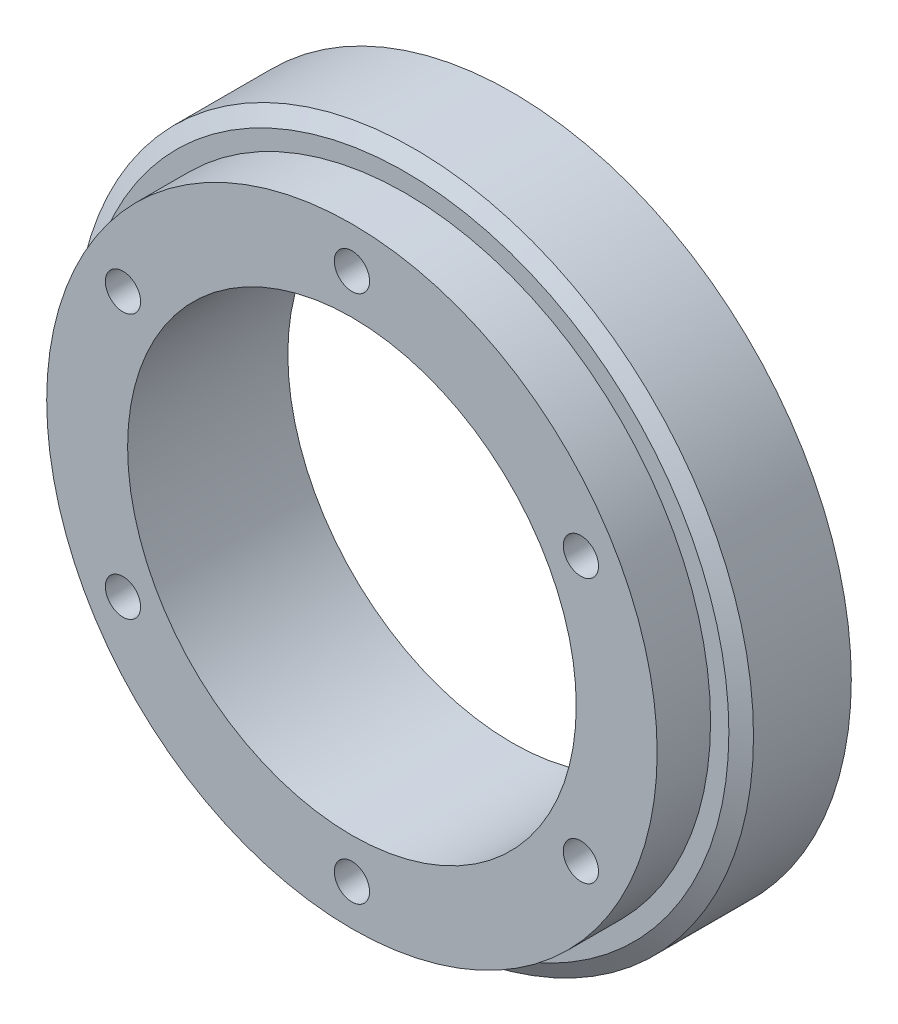
ISO-10303-21;
HEADER;
FILE_DESCRIPTION(('STEP AP214'),'2;1');
FILE_NAME('part.step','',(''),(''),'','','');
FILE_SCHEMA(('AUTOMOTIVE_DESIGN { 1 0 10303 214 1 1 1 1 }'));
ENDSEC;
DATA;
#1=APPLICATION_CONTEXT('core data for automotive mechanical design processes');
#2=APPLICATION_PROTOCOL_DEFINITION('international standard','automotive_design',2000,#1);
#3=PRODUCT_CONTEXT('',#1,'mechanical');
#4=PRODUCT('Part','Part','',(#3));
#5=PRODUCT_RELATED_PRODUCT_CATEGORY('part','',(#4));
#6=PRODUCT_DEFINITION_FORMATION('','',#4);
#7=PRODUCT_DEFINITION_CONTEXT('part definition',#1,'design');
#8=PRODUCT_DEFINITION('design','',#6,#7);
#9=PRODUCT_DEFINITION_SHAPE('','',#8);
#10=(LENGTH_UNIT() NAMED_UNIT(*) SI_UNIT(.MILLI.,.METRE.));
#11=(NAMED_UNIT(*) PLANE_ANGLE_UNIT() SI_UNIT($,.RADIAN.));
#12=(NAMED_UNIT(*) SI_UNIT($,.STERADIAN.) SOLID_ANGLE_UNIT());
#13=UNCERTAINTY_MEASURE_WITH_UNIT(LENGTH_MEASURE(1.E-05),#10,'distance_accuracy_value','');
#14=(GEOMETRIC_REPRESENTATION_CONTEXT(3) GLOBAL_UNCERTAINTY_ASSIGNED_CONTEXT((#13)) GLOBAL_UNIT_ASSIGNED_CONTEXT((#10,
#11,#12)) REPRESENTATION_CONTEXT('',''));
#15=CARTESIAN_POINT('',(0.,0.,0.));
#16=DIRECTION('',(0.,0.,1.));
#17=DIRECTION('',(1.,0.,0.));
#18=AXIS2_PLACEMENT_3D('',#15,#16,#17);
#19=CARTESIAN_POINT('',(0.,21.,0.));
#20=DIRECTION('',(0.,0.,1.));
#21=DIRECTION('',(1.,0.,0.));
#22=AXIS2_PLACEMENT_3D('',#19,#20,#21);
#23=PLANE('',#22);
#24=CARTESIAN_POINT('',(21.4341287436647,12.3750000000003,0.));
#25=DIRECTION('',(0.,0.,-1.));
#26=DIRECTION('',(-1.,0.,0.));
#27=AXIS2_PLACEMENT_3D('',#24,#25,#26);
#28=CIRCLE('',#27,1.64999999999999);
#29=CARTESIAN_POINT('',(19.7841287436647,12.3750000000003,0.));
#30=VERTEX_POINT('',#29);
#31=EDGE_CURVE('E102',#30,#30,#28,.T.);
#32=ORIENTED_EDGE('',*,*,#31,.F.);
#33=EDGE_LOOP('',(#32));
#34=FACE_BOUND('',#33,.T.);
#35=CARTESIAN_POINT('',(21.434128743665,-12.3749999999998,0.));
#36=DIRECTION('',(0.,0.,-1.));
#37=DIRECTION('',(-1.,0.,0.));
#38=AXIS2_PLACEMENT_3D('',#35,#36,#37);
#39=CIRCLE('',#38,1.64999999999999);
#40=CARTESIAN_POINT('',(19.784128743665,-12.3749999999998,0.));
#41=VERTEX_POINT('',#40);
#42=EDGE_CURVE('E96',#41,#41,#39,.T.);
#43=ORIENTED_EDGE('',*,*,#42,.F.);
#44=EDGE_LOOP('',(#43));
#45=FACE_BOUND('',#44,.T.);
#46=CARTESIAN_POINT('',(0.,-24.75,0.));
#47=DIRECTION('',(0.,0.,-1.));
#48=DIRECTION('',(-1.,0.,0.));
#49=AXIS2_PLACEMENT_3D('',#46,#47,#48);
#50=CIRCLE('',#49,1.64999999999999);
#51=CARTESIAN_POINT('',(-1.64999999999999,-24.75,0.));
#52=VERTEX_POINT('',#51);
#53=EDGE_CURVE('E90',#52,#52,#50,.T.);
#54=ORIENTED_EDGE('',*,*,#53,.F.);
#55=EDGE_LOOP('',(#54));
#56=FACE_BOUND('',#55,.T.);
#57=CARTESIAN_POINT('',(-21.4341287436648,-12.3750000000001,0.));
#58=DIRECTION('',(0.,0.,-1.));
#59=DIRECTION('',(-1.,0.,0.));
#60=AXIS2_PLACEMENT_3D('',#57,#58,#59);
#61=CIRCLE('',#60,1.64999999999999);
#62=CARTESIAN_POINT('',(-23.0841287436648,-12.3750000000001,0.));
#63=VERTEX_POINT('',#62);
#64=EDGE_CURVE('E84',#63,#63,#61,.T.);
#65=ORIENTED_EDGE('',*,*,#64,.F.);
#66=EDGE_LOOP('',(#65));
#67=FACE_BOUND('',#66,.T.);
#68=CARTESIAN_POINT('',(-21.4341287436649,12.375,0.));
#69=DIRECTION('',(0.,0.,-1.));
#70=DIRECTION('',(-1.,0.,0.));
#71=AXIS2_PLACEMENT_3D('',#68,#69,#70);
#72=CIRCLE('',#71,1.64999999999999);
#73=CARTESIAN_POINT('',(-23.0841287436649,12.375,0.));
#74=VERTEX_POINT('',#73);
#75=EDGE_CURVE('E78',#74,#74,#72,.T.);
#76=ORIENTED_EDGE('',*,*,#75,.F.);
#77=EDGE_LOOP('',(#76));
#78=FACE_BOUND('',#77,.T.);
#79=CARTESIAN_POINT('',(0.,24.75,0.));
#80=DIRECTION('',(0.,0.,-1.));
#81=DIRECTION('',(-1.,0.,0.));
#82=AXIS2_PLACEMENT_3D('',#79,#80,#81);
#83=CIRCLE('',#82,1.64999999999999);
#84=CARTESIAN_POINT('',(-1.64999999999999,24.75,0.));
#85=VERTEX_POINT('',#84);
#86=EDGE_CURVE('E72',#85,#85,#83,.T.);
#87=ORIENTED_EDGE('',*,*,#86,.F.);
#88=EDGE_LOOP('',(#87));
#89=FACE_BOUND('',#88,.T.);
#90=CARTESIAN_POINT('',(0.,0.,0.));
#91=DIRECTION('',(0.,0.,1.));
#92=DIRECTION('',(1.,0.,0.));
#93=AXIS2_PLACEMENT_3D('',#90,#91,#92);
#94=CIRCLE('',#93,31.75);
#95=CARTESIAN_POINT('',(31.75,0.,0.));
#96=VERTEX_POINT('',#95);
#97=EDGE_CURVE('E10',#96,#96,#94,.T.);
#98=ORIENTED_EDGE('',*,*,#97,.F.);
#99=EDGE_LOOP('',(#98));
#100=FACE_BOUND('',#99,.T.);
#101=CARTESIAN_POINT('',(0.,0.,0.));
#102=DIRECTION('',(0.,0.,1.));
#103=DIRECTION('',(1.,0.,0.));
#104=AXIS2_PLACEMENT_3D('',#101,#102,#103);
#105=CIRCLE('',#104,21.);
#106=CARTESIAN_POINT('',(21.,0.,0.));
#107=VERTEX_POINT('',#106);
#108=EDGE_CURVE('E66',#107,#107,#105,.T.);
#109=ORIENTED_EDGE('',*,*,#108,.T.);
#110=EDGE_LOOP('',(#109));
#111=FACE_BOUND('',#110,.T.);
#112=ADVANCED_FACE('F41',(#34,#45,#56,#67,#78,#89,#100,#111),#23,.F.);
#113=CARTESIAN_POINT('',(0.,0.,15.));
#114=DIRECTION('',(0.,0.,1.));
#115=DIRECTION('',(1.,0.,0.));
#116=AXIS2_PLACEMENT_3D('',#113,#114,#115);
#117=CYLINDRICAL_SURFACE('',#116,31.75);
#118=CARTESIAN_POINT('',(0.,0.,9.15568296633715));
#119=DIRECTION('',(0.,0.,1.));
#120=DIRECTION('',(1.,0.,0.));
#121=AXIS2_PLACEMENT_3D('',#118,#119,#120);
#122=CIRCLE('',#121,31.75);
#123=CARTESIAN_POINT('',(31.75,0.,9.15568296633715));
#124=VERTEX_POINT('',#123);
#125=EDGE_CURVE('E47',#124,#124,#122,.T.);
#126=ORIENTED_EDGE('',*,*,#125,.F.);
#127=EDGE_LOOP('',(#126));
#128=FACE_BOUND('',#127,.T.);
#129=ORIENTED_EDGE('',*,*,#97,.T.);
#130=EDGE_LOOP('',(#129));
#131=FACE_BOUND('',#130,.T.);
#132=ADVANCED_FACE('F110',(#128,#131),#117,.T.);
#133=CARTESIAN_POINT('',(0.,0.,9.15568296633715));
#134=DIRECTION('',(0.,0.,-1.));
#135=DIRECTION('',(-1.,0.,0.));
#136=AXIS2_PLACEMENT_3D('',#133,#134,#135);
#137=CONICAL_SURFACE('',#136,31.75,1.0471975511966);
#138=CARTESIAN_POINT('',(0.,0.,10.));
#139=DIRECTION('',(0.,0.,1.));
#140=DIRECTION('',(1.,0.,0.));
#141=AXIS2_PLACEMENT_3D('',#138,#139,#140);
#142=CIRCLE('',#141,30.2876);
#143=CARTESIAN_POINT('',(30.2876,0.,10.));
#144=VERTEX_POINT('',#143);
#145=EDGE_CURVE('E51',#144,#144,#142,.T.);
#146=ORIENTED_EDGE('',*,*,#145,.F.);
#147=EDGE_LOOP('',(#146));
#148=FACE_BOUND('',#147,.T.);
#149=ORIENTED_EDGE('',*,*,#125,.T.);
#150=EDGE_LOOP('',(#149));
#151=FACE_BOUND('',#150,.T.);
#152=ADVANCED_FACE('F147',(#148,#151),#137,.T.);
#153=CARTESIAN_POINT('',(0.,28.575,10.));
#154=DIRECTION('',(0.,0.,-1.));
#155=DIRECTION('',(-1.,0.,0.));
#156=AXIS2_PLACEMENT_3D('',#153,#154,#155);
#157=PLANE('',#156);
#158=CARTESIAN_POINT('',(0.,0.,10.));
#159=DIRECTION('',(0.,0.,1.));
#160=DIRECTION('',(1.,0.,0.));
#161=AXIS2_PLACEMENT_3D('',#158,#159,#160);
#162=CIRCLE('',#161,28.575);
#163=CARTESIAN_POINT('',(28.575,0.,10.));
#164=VERTEX_POINT('',#163);
#165=EDGE_CURVE('E55',#164,#164,#162,.T.);
#166=ORIENTED_EDGE('',*,*,#165,.F.);
#167=EDGE_LOOP('',(#166));
#168=FACE_BOUND('',#167,.T.);
#169=ORIENTED_EDGE('',*,*,#145,.T.);
#170=EDGE_LOOP('',(#169));
#171=FACE_BOUND('',#170,.T.);
#172=ADVANCED_FACE('F141',(#168,#171),#157,.F.);
#173=CARTESIAN_POINT('',(0.,0.,15.));
#174=DIRECTION('',(0.,0.,1.));
#175=DIRECTION('',(1.,0.,0.));
#176=AXIS2_PLACEMENT_3D('',#173,#174,#175);
#177=CYLINDRICAL_SURFACE('',#176,28.575);
#178=CARTESIAN_POINT('',(0.,0.,15.));
#179=DIRECTION('',(0.,0.,1.));
#180=DIRECTION('',(1.,0.,0.));
#181=AXIS2_PLACEMENT_3D('',#178,#179,#180);
#182=CIRCLE('',#181,28.575);
#183=CARTESIAN_POINT('',(28.575,0.,15.));
#184=VERTEX_POINT('',#183);
#185=EDGE_CURVE('E60',#184,#184,#182,.T.);
#186=ORIENTED_EDGE('',*,*,#185,.F.);
#187=EDGE_LOOP('',(#186));
#188=FACE_BOUND('',#187,.T.);
#189=ORIENTED_EDGE('',*,*,#165,.T.);
#190=EDGE_LOOP('',(#189));
#191=FACE_BOUND('',#190,.T.);
#192=ADVANCED_FACE('F134',(#188,#191),#177,.T.);
#193=CARTESIAN_POINT('',(0.,28.575,15.));
#194=DIRECTION('',(0.,0.,-1.));
#195=DIRECTION('',(-1.,0.,0.));
#196=AXIS2_PLACEMENT_3D('',#193,#194,#195);
#197=PLANE('',#196);
#198=CARTESIAN_POINT('',(21.4341287436647,12.3750000000003,15.));
#199=DIRECTION('',(0.,0.,-1.));
#200=DIRECTION('',(-1.,0.,0.));
#201=AXIS2_PLACEMENT_3D('',#198,#199,#200);
#202=CIRCLE('',#201,1.65);
#203=CARTESIAN_POINT('',(19.7841287436647,12.3750000000003,15.));
#204=VERTEX_POINT('',#203);
#205=EDGE_CURVE('E99',#204,#204,#202,.T.);
#206=ORIENTED_EDGE('',*,*,#205,.T.);
#207=EDGE_LOOP('',(#206));
#208=FACE_BOUND('',#207,.T.);
#209=CARTESIAN_POINT('',(21.434128743665,-12.3749999999998,15.));
#210=DIRECTION('',(0.,0.,-1.));
#211=DIRECTION('',(-1.,0.,0.));
#212=AXIS2_PLACEMENT_3D('',#209,#210,#211);
#213=CIRCLE('',#212,1.65);
#214=CARTESIAN_POINT('',(19.784128743665,-12.3749999999998,15.));
#215=VERTEX_POINT('',#214);
#216=EDGE_CURVE('E93',#215,#215,#213,.T.);
#217=ORIENTED_EDGE('',*,*,#216,.T.);
#218=EDGE_LOOP('',(#217));
#219=FACE_BOUND('',#218,.T.);
#220=CARTESIAN_POINT('',(0.,-24.75,15.));
#221=DIRECTION('',(0.,0.,-1.));
#222=DIRECTION('',(-1.,0.,0.));
#223=AXIS2_PLACEMENT_3D('',#220,#221,#222);
#224=CIRCLE('',#223,1.65);
#225=CARTESIAN_POINT('',(-1.65,-24.75,15.));
#226=VERTEX_POINT('',#225);
#227=EDGE_CURVE('E87',#226,#226,#224,.T.);
#228=ORIENTED_EDGE('',*,*,#227,.T.);
#229=EDGE_LOOP('',(#228));
#230=FACE_BOUND('',#229,.T.);
#231=CARTESIAN_POINT('',(-21.4341287436648,-12.3750000000001,15.));
#232=DIRECTION('',(0.,0.,-1.));
#233=DIRECTION('',(-1.,0.,0.));
#234=AXIS2_PLACEMENT_3D('',#231,#232,#233);
#235=CIRCLE('',#234,1.65);
#236=CARTESIAN_POINT('',(-23.0841287436648,-12.3750000000001,15.));
#237=VERTEX_POINT('',#236);
#238=EDGE_CURVE('E81',#237,#237,#235,.T.);
#239=ORIENTED_EDGE('',*,*,#238,.T.);
#240=EDGE_LOOP('',(#239));
#241=FACE_BOUND('',#240,.T.);
#242=CARTESIAN_POINT('',(-21.4341287436649,12.375,15.));
#243=DIRECTION('',(0.,0.,-1.));
#244=DIRECTION('',(-1.,0.,0.));
#245=AXIS2_PLACEMENT_3D('',#242,#243,#244);
#246=CIRCLE('',#245,1.65);
#247=CARTESIAN_POINT('',(-23.0841287436649,12.375,15.));
#248=VERTEX_POINT('',#247);
#249=EDGE_CURVE('E75',#248,#248,#246,.T.);
#250=ORIENTED_EDGE('',*,*,#249,.T.);
#251=EDGE_LOOP('',(#250));
#252=FACE_BOUND('',#251,.T.);
#253=CARTESIAN_POINT('',(0.,24.75,15.));
#254=DIRECTION('',(0.,0.,-1.));
#255=DIRECTION('',(-1.,0.,0.));
#256=AXIS2_PLACEMENT_3D('',#253,#254,#255);
#257=CIRCLE('',#256,1.65);
#258=CARTESIAN_POINT('',(-1.65,24.75,15.));
#259=VERTEX_POINT('',#258);
#260=EDGE_CURVE('E69',#259,#259,#257,.T.);
#261=ORIENTED_EDGE('',*,*,#260,.T.);
#262=EDGE_LOOP('',(#261));
#263=FACE_BOUND('',#262,.T.);
#264=CARTESIAN_POINT('',(0.,0.,15.));
#265=DIRECTION('',(0.,0.,1.));
#266=DIRECTION('',(1.,0.,0.));
#267=AXIS2_PLACEMENT_3D('',#264,#265,#266);
#268=CIRCLE('',#267,21.);
#269=CARTESIAN_POINT('',(21.,0.,15.));
#270=VERTEX_POINT('',#269);
#271=EDGE_CURVE('E63',#270,#270,#268,.T.);
#272=ORIENTED_EDGE('',*,*,#271,.F.);
#273=EDGE_LOOP('',(#272));
#274=FACE_BOUND('',#273,.T.);
#275=ORIENTED_EDGE('',*,*,#185,.T.);
#276=EDGE_LOOP('',(#275));
#277=FACE_BOUND('',#276,.T.);
#278=ADVANCED_FACE('F128',(#208,#219,#230,#241,#252,#263,#274,#277),#197,.F.);
#279=CARTESIAN_POINT('',(0.,0.,15.));
#280=DIRECTION('',(0.,0.,1.));
#281=DIRECTION('',(1.,0.,0.));
#282=AXIS2_PLACEMENT_3D('',#279,#280,#281);
#283=CYLINDRICAL_SURFACE('',#282,21.);
#284=ORIENTED_EDGE('',*,*,#108,.F.);
#285=EDGE_LOOP('',(#284));
#286=FACE_BOUND('',#285,.T.);
#287=ORIENTED_EDGE('',*,*,#271,.T.);
#288=EDGE_LOOP('',(#287));
#289=FACE_BOUND('',#288,.T.);
#290=ADVANCED_FACE('F124',(#286,#289),#283,.F.);
#291=CARTESIAN_POINT('',(0.,24.75,0.));
#292=DIRECTION('',(0.,0.,-1.));
#293=DIRECTION('',(-1.,0.,0.));
#294=AXIS2_PLACEMENT_3D('',#291,#292,#293);
#295=CYLINDRICAL_SURFACE('',#294,1.64999999999999);
#296=ORIENTED_EDGE('',*,*,#260,.F.);
#297=EDGE_LOOP('',(#296));
#298=FACE_BOUND('',#297,.T.);
#299=ORIENTED_EDGE('',*,*,#86,.T.);
#300=EDGE_LOOP('',(#299));
#301=FACE_BOUND('',#300,.T.);
#302=ADVANCED_FACE('F127',(#298,#301),#295,.F.);
#303=CARTESIAN_POINT('',(-21.4341287436649,12.375,0.));
#304=DIRECTION('',(0.,0.,-1.));
#305=DIRECTION('',(-1.,0.,0.));
#306=AXIS2_PLACEMENT_3D('',#303,#304,#305);
#307=CYLINDRICAL_SURFACE('',#306,1.64999999999999);
#308=ORIENTED_EDGE('',*,*,#249,.F.);
#309=EDGE_LOOP('',(#308));
#310=FACE_BOUND('',#309,.T.);
#311=ORIENTED_EDGE('',*,*,#75,.T.);
#312=EDGE_LOOP('',(#311));
#313=FACE_BOUND('',#312,.T.);
#314=ADVANCED_FACE('F160',(#310,#313),#307,.F.);
#315=CARTESIAN_POINT('',(-21.4341287436648,-12.3750000000001,0.));
#316=DIRECTION('',(0.,0.,-1.));
#317=DIRECTION('',(-1.,0.,0.));
#318=AXIS2_PLACEMENT_3D('',#315,#316,#317);
#319=CYLINDRICAL_SURFACE('',#318,1.64999999999999);
#320=ORIENTED_EDGE('',*,*,#238,.F.);
#321=EDGE_LOOP('',(#320));
#322=FACE_BOUND('',#321,.T.);
#323=ORIENTED_EDGE('',*,*,#64,.T.);
#324=EDGE_LOOP('',(#323));
#325=FACE_BOUND('',#324,.T.);
#326=ADVANCED_FACE('F164',(#322,#325),#319,.F.);
#327=CARTESIAN_POINT('',(0.,-24.75,0.));
#328=DIRECTION('',(0.,0.,-1.));
#329=DIRECTION('',(-1.,0.,0.));
#330=AXIS2_PLACEMENT_3D('',#327,#328,#329);
#331=CYLINDRICAL_SURFACE('',#330,1.64999999999999);
#332=ORIENTED_EDGE('',*,*,#227,.F.);
#333=EDGE_LOOP('',(#332));
#334=FACE_BOUND('',#333,.T.);
#335=ORIENTED_EDGE('',*,*,#53,.T.);
#336=EDGE_LOOP('',(#335));
#337=FACE_BOUND('',#336,.T.);
#338=ADVANCED_FACE('F168',(#334,#337),#331,.F.);
#339=CARTESIAN_POINT('',(21.434128743665,-12.3749999999998,0.));
#340=DIRECTION('',(0.,0.,-1.));
#341=DIRECTION('',(-1.,0.,0.));
#342=AXIS2_PLACEMENT_3D('',#339,#340,#341);
#343=CYLINDRICAL_SURFACE('',#342,1.64999999999999);
#344=ORIENTED_EDGE('',*,*,#216,.F.);
#345=EDGE_LOOP('',(#344));
#346=FACE_BOUND('',#345,.T.);
#347=ORIENTED_EDGE('',*,*,#42,.T.);
#348=EDGE_LOOP('',(#347));
#349=FACE_BOUND('',#348,.T.);
#350=ADVANCED_FACE('F172',(#346,#349),#343,.F.);
#351=CARTESIAN_POINT('',(21.4341287436647,12.3750000000003,0.));
#352=DIRECTION('',(0.,0.,-1.));
#353=DIRECTION('',(-1.,0.,0.));
#354=AXIS2_PLACEMENT_3D('',#351,#352,#353);
#355=CYLINDRICAL_SURFACE('',#354,1.64999999999999);
#356=ORIENTED_EDGE('',*,*,#205,.F.);
#357=EDGE_LOOP('',(#356));
#358=FACE_BOUND('',#357,.T.);
#359=ORIENTED_EDGE('',*,*,#31,.T.);
#360=EDGE_LOOP('',(#359));
#361=FACE_BOUND('',#360,.T.);
#362=ADVANCED_FACE('F106',(#358,#361),#355,.F.);
#363=CLOSED_SHELL('',(#112,#132,#152,#172,#192,#278,#290,#302,#314,#326,#338,#350,#362));
#364=MANIFOLD_SOLID_BREP('B2',#363);
#365=ADVANCED_BREP_SHAPE_REPRESENTATION('',(#18,#364),#14);
#366=SHAPE_DEFINITION_REPRESENTATION(#9,#365);
ENDSEC;
END-ISO-10303-21;
